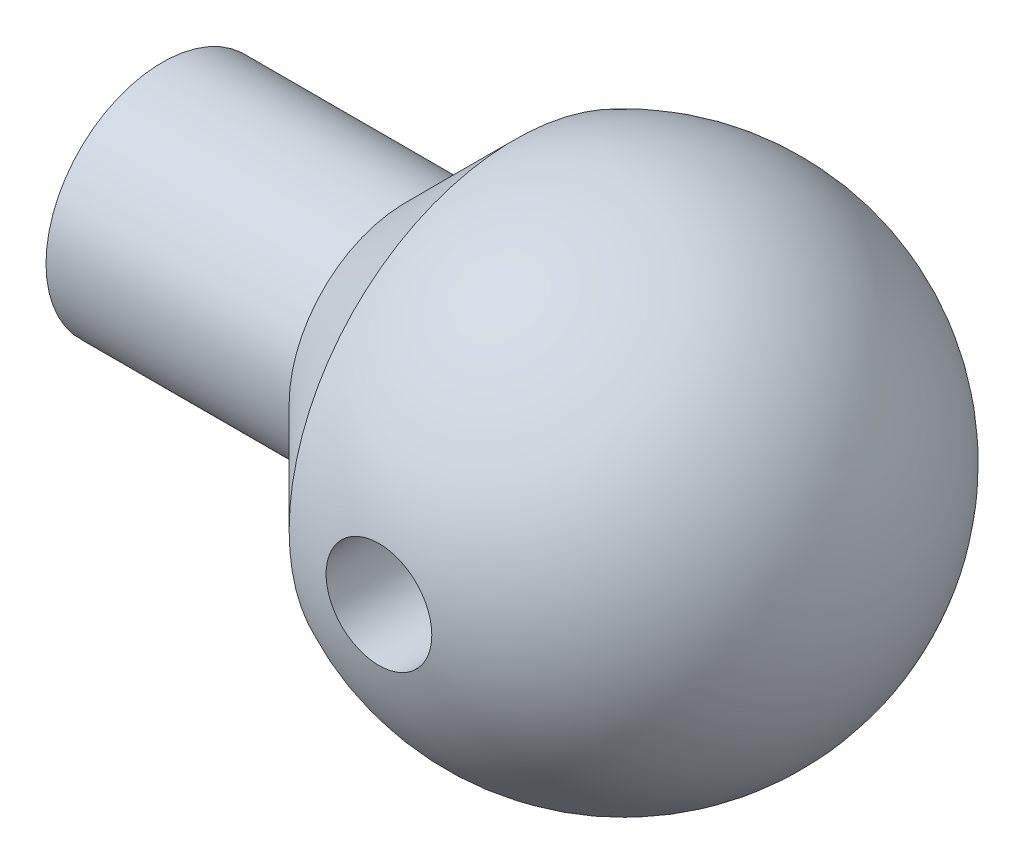
ISO-10303-21;
HEADER;
FILE_DESCRIPTION(('STEP AP214'),'2;1');
FILE_NAME('part.step','',(''),(''),'','','');
FILE_SCHEMA(('AUTOMOTIVE_DESIGN { 1 0 10303 214 1 1 1 1 }'));
ENDSEC;
DATA;
#1=APPLICATION_CONTEXT('core data for automotive mechanical design processes');
#2=APPLICATION_PROTOCOL_DEFINITION('international standard','automotive_design',2000,#1);
#3=PRODUCT_CONTEXT('',#1,'mechanical');
#4=PRODUCT('Part','Part','',(#3));
#5=PRODUCT_RELATED_PRODUCT_CATEGORY('part','',(#4));
#6=PRODUCT_DEFINITION_FORMATION('','',#4);
#7=PRODUCT_DEFINITION_CONTEXT('part definition',#1,'design');
#8=PRODUCT_DEFINITION('design','',#6,#7);
#9=PRODUCT_DEFINITION_SHAPE('','',#8);
#10=(LENGTH_UNIT() NAMED_UNIT(*) SI_UNIT(.MILLI.,.METRE.));
#11=(NAMED_UNIT(*) PLANE_ANGLE_UNIT() SI_UNIT($,.RADIAN.));
#12=(NAMED_UNIT(*) SI_UNIT($,.STERADIAN.) SOLID_ANGLE_UNIT());
#13=UNCERTAINTY_MEASURE_WITH_UNIT(LENGTH_MEASURE(1.E-05),#10,'distance_accuracy_value','');
#14=(GEOMETRIC_REPRESENTATION_CONTEXT(3) GLOBAL_UNCERTAINTY_ASSIGNED_CONTEXT((#13)) GLOBAL_UNIT_ASSIGNED_CONTEXT((#10,
#11,#12)) REPRESENTATION_CONTEXT('',''));
#15=CARTESIAN_POINT('',(0.,0.,0.));
#16=DIRECTION('',(0.,0.,1.));
#17=DIRECTION('',(1.,0.,0.));
#18=AXIS2_PLACEMENT_3D('',#15,#16,#17);
#19=CARTESIAN_POINT('',(0.,0.,0.));
#20=DIRECTION('',(1.,0.,0.));
#21=DIRECTION('',(0.,0.,-1.));
#22=AXIS2_PLACEMENT_3D('',#19,#20,#21);
#23=CONICAL_SURFACE('',#22,0.,1.02974425867666);
#24=CARTESIAN_POINT('',(1.98284004279094,0.,0.));
#25=DIRECTION('',(-1.,0.,0.));
#26=DIRECTION('',(0.,0.,1.));
#27=AXIS2_PLACEMENT_3D('',#24,#25,#26);
#28=CIRCLE('',#27,3.3);
#29=CARTESIAN_POINT('',(1.98284004279094,0.,3.3));
#30=VERTEX_POINT('',#29);
#31=EDGE_CURVE('E11',#30,#30,#28,.T.);
#32=ORIENTED_EDGE('',*,*,#31,.T.);
#33=EDGE_LOOP('',(#32));
#34=FACE_BOUND('',#33,.T.);
#35=CARTESIAN_POINT('',(0.,0.,0.));
#36=VERTEX_POINT('',#35);
#37=VERTEX_LOOP('',#36);
#38=FACE_BOUND('',#37,.T.);
#39=ADVANCED_FACE('F38',(#34,#38),#23,.T.);
#40=CARTESIAN_POINT('',(0.,0.,0.));
#41=DIRECTION('',(-1.,0.,0.));
#42=DIRECTION('',(0.,0.,1.));
#43=AXIS2_PLACEMENT_3D('',#40,#41,#42);
#44=CYLINDRICAL_SURFACE('',#43,3.3);
#45=CARTESIAN_POINT('',(8.88284004279095,0.,0.));
#46=DIRECTION('',(-1.,0.,0.));
#47=DIRECTION('',(0.,0.,1.));
#48=AXIS2_PLACEMENT_3D('',#45,#46,#47);
#49=CIRCLE('',#48,3.3);
#50=CARTESIAN_POINT('',(8.88284004279095,0.,3.3));
#51=VERTEX_POINT('',#50);
#52=EDGE_CURVE('E46',#51,#51,#49,.T.);
#53=ORIENTED_EDGE('',*,*,#52,.T.);
#54=EDGE_LOOP('',(#53));
#55=FACE_BOUND('',#54,.T.);
#56=ORIENTED_EDGE('',*,*,#31,.F.);
#57=EDGE_LOOP('',(#56));
#58=FACE_BOUND('',#57,.T.);
#59=ADVANCED_FACE('F51',(#55,#58),#44,.T.);
#60=CARTESIAN_POINT('',(8.88284004279095,0.,0.));
#61=DIRECTION('',(1.,0.,0.));
#62=DIRECTION('',(0.,0.,-1.));
#63=AXIS2_PLACEMENT_3D('',#60,#61,#62);
#64=CONICAL_SURFACE('',#63,3.3,0.785398163397451);
#65=CARTESIAN_POINT('',(11.9828400427909,0.,0.));
#66=DIRECTION('',(-1.,0.,0.));
#67=DIRECTION('',(0.,0.,1.));
#68=AXIS2_PLACEMENT_3D('',#65,#66,#67);
#69=CIRCLE('',#68,6.4);
#70=CARTESIAN_POINT('',(11.9828400427909,0.,6.4));
#71=VERTEX_POINT('',#70);
#72=EDGE_CURVE('E85',#71,#71,#69,.T.);
#73=ORIENTED_EDGE('',*,*,#72,.T.);
#74=EDGE_LOOP('',(#73));
#75=FACE_BOUND('',#74,.T.);
#76=ORIENTED_EDGE('',*,*,#52,.F.);
#77=EDGE_LOOP('',(#76));
#78=FACE_BOUND('',#77,.T.);
#79=ADVANCED_FACE('F56',(#75,#78),#64,.T.);
#80=CARTESIAN_POINT('',(15.0828400427909,0.,0.));
#81=DIRECTION('',(-1.,0.,0.));
#82=DIRECTION('',(0.,-1.,0.));
#83=AXIS2_PLACEMENT_3D('',#80,#81,#82);
#84=SPHERICAL_SURFACE('',#83,7.11125867902441);
#85=CARTESIAN_POINT('',(15.0828400427909,0.,6.9512588787931));
#86=DIRECTION('',(0.,0.,-1.));
#87=DIRECTION('',(-1.,0.,0.));
#88=AXIS2_PLACEMENT_3D('',#85,#86,#87);
#89=CIRCLE('',#88,1.5);
#90=CARTESIAN_POINT('',(16.5828400427909,0.,6.95125887879311));
#91=VERTEX_POINT('',#90);
#92=EDGE_CURVE('E41',#91,#91,#89,.F.);
#93=ORIENTED_EDGE('',*,*,#92,.F.);
#94=EDGE_LOOP('',(#93));
#95=FACE_BOUND('',#94,.T.);
#96=CARTESIAN_POINT('',(15.0828400427909,0.,-6.95125887879311));
#97=DIRECTION('',(0.,0.,1.));
#98=DIRECTION('',(1.,0.,0.));
#99=AXIS2_PLACEMENT_3D('',#96,#97,#98);
#100=CIRCLE('',#99,1.5);
#101=CARTESIAN_POINT('',(16.5828400427909,0.,-6.95125887879311));
#102=VERTEX_POINT('',#101);
#103=EDGE_CURVE('E81',#102,#102,#100,.F.);
#104=ORIENTED_EDGE('',*,*,#103,.F.);
#105=EDGE_LOOP('',(#104));
#106=FACE_BOUND('',#105,.T.);
#107=ORIENTED_EDGE('',*,*,#72,.F.);
#108=EDGE_LOOP('',(#107));
#109=FACE_BOUND('',#108,.T.);
#110=ADVANCED_FACE('F63',(#95,#106,#109),#84,.T.);
#111=CARTESIAN_POINT('',(15.0828400427909,0.,-7.11125867902441));
#112=DIRECTION('',(0.,0.,1.));
#113=DIRECTION('',(1.,0.,0.));
#114=AXIS2_PLACEMENT_3D('',#111,#112,#113);
#115=CYLINDRICAL_SURFACE('',#114,1.5);
#116=CARTESIAN_POINT('',(16.5828400427909,0.,6.95125887879311));
#117=CARTESIAN_POINT('',(16.5828400427909,0.,6.80644098548492));
#118=CARTESIAN_POINT('',(16.5828400427909,0.,6.66162309217673));
#119=CARTESIAN_POINT('',(16.5828400427909,0.,6.37198730556035));
#120=CARTESIAN_POINT('',(16.5828400427909,0.,6.22716941225216));
#121=CARTESIAN_POINT('',(16.5828400427909,0.,5.93753362563578));
#122=CARTESIAN_POINT('',(16.5828400427909,0.,5.79271573232759));
#123=CARTESIAN_POINT('',(16.5828400427909,0.,5.50307994571121));
#124=CARTESIAN_POINT('',(16.5828400427909,0.,5.35826205240302));
#125=CARTESIAN_POINT('',(16.5828400427909,0.,5.06862626578664));
#126=CARTESIAN_POINT('',(16.5828400427909,0.,4.92380837247845));
#127=CARTESIAN_POINT('',(16.5828400427909,0.,4.63417258586207));
#128=CARTESIAN_POINT('',(16.5828400427909,0.,4.48935469255388));
#129=CARTESIAN_POINT('',(16.5828400427909,0.,4.1997189059375));
#130=CARTESIAN_POINT('',(16.5828400427909,0.,4.05490101262931));
#131=CARTESIAN_POINT('',(16.5828400427909,0.,3.76526522601293));
#132=CARTESIAN_POINT('',(16.5828400427909,0.,3.62044733270474));
#133=CARTESIAN_POINT('',(16.5828400427909,0.,3.33081154608836));
#134=CARTESIAN_POINT('',(16.5828400427909,0.,3.18599365278017));
#135=CARTESIAN_POINT('',(16.5828400427909,0.,2.89635786616379));
#136=CARTESIAN_POINT('',(16.5828400427909,0.,2.7515399728556));
#137=CARTESIAN_POINT('',(16.5828400427909,0.,2.46190418623922));
#138=CARTESIAN_POINT('',(16.5828400427909,0.,2.31708629293103));
#139=CARTESIAN_POINT('',(16.5828400427909,0.,2.02745050631465));
#140=CARTESIAN_POINT('',(16.5828400427909,0.,1.88263261300646));
#141=CARTESIAN_POINT('',(16.5828400427909,0.,1.59299682639009));
#142=CARTESIAN_POINT('',(16.5828400427909,0.,1.4481789330819));
#143=CARTESIAN_POINT('',(16.5828400427909,0.,1.15854314646552));
#144=CARTESIAN_POINT('',(16.5828400427909,0.,1.01372525315733));
#145=CARTESIAN_POINT('',(16.5828400427909,0.,0.724089466540948));
#146=CARTESIAN_POINT('',(16.5828400427909,0.,0.579271573232758));
#147=CARTESIAN_POINT('',(16.5828400427909,0.,0.289635786616379));
#148=CARTESIAN_POINT('',(16.5828400427909,0.,0.144817893308189));
#149=CARTESIAN_POINT('',(16.5828400427909,0.,-0.144817893308191));
#150=CARTESIAN_POINT('',(16.5828400427909,0.,-0.28963578661638));
#151=CARTESIAN_POINT('',(16.5828400427909,0.,-0.57927157323276));
#152=CARTESIAN_POINT('',(16.5828400427909,0.,-0.72408946654095));
#153=CARTESIAN_POINT('',(16.5828400427909,0.,-1.01372525315733));
#154=CARTESIAN_POINT('',(16.5828400427909,0.,-1.15854314646552));
#155=CARTESIAN_POINT('',(16.5828400427909,0.,-1.4481789330819));
#156=CARTESIAN_POINT('',(16.5828400427909,0.,-1.59299682639009));
#157=CARTESIAN_POINT('',(16.5828400427909,0.,-1.88263261300647));
#158=CARTESIAN_POINT('',(16.5828400427909,0.,-2.02745050631466));
#159=CARTESIAN_POINT('',(16.5828400427909,0.,-2.31708629293104));
#160=CARTESIAN_POINT('',(16.5828400427909,0.,-2.46190418623923));
#161=CARTESIAN_POINT('',(16.5828400427909,0.,-2.75153997285561));
#162=CARTESIAN_POINT('',(16.5828400427909,0.,-2.8963578661638));
#163=CARTESIAN_POINT('',(16.5828400427909,0.,-3.18599365278018));
#164=CARTESIAN_POINT('',(16.5828400427909,0.,-3.33081154608836));
#165=CARTESIAN_POINT('',(16.5828400427909,0.,-3.62044733270474));
#166=CARTESIAN_POINT('',(16.5828400427909,0.,-3.76526522601293));
#167=CARTESIAN_POINT('',(16.5828400427909,0.,-4.05490101262931));
#168=CARTESIAN_POINT('',(16.5828400427909,0.,-4.1997189059375));
#169=CARTESIAN_POINT('',(16.5828400427909,0.,-4.48935469255388));
#170=CARTESIAN_POINT('',(16.5828400427909,0.,-4.63417258586207));
#171=CARTESIAN_POINT('',(16.5828400427909,0.,-4.92380837247845));
#172=CARTESIAN_POINT('',(16.5828400427909,0.,-5.06862626578664));
#173=CARTESIAN_POINT('',(16.5828400427909,0.,-5.35826205240302));
#174=CARTESIAN_POINT('',(16.5828400427909,0.,-5.50307994571121));
#175=CARTESIAN_POINT('',(16.5828400427909,0.,-5.79271573232759));
#176=CARTESIAN_POINT('',(16.5828400427909,0.,-5.93753362563578));
#177=CARTESIAN_POINT('',(16.5828400427909,0.,-6.22716941225216));
#178=CARTESIAN_POINT('',(16.5828400427909,0.,-6.37198730556035));
#179=CARTESIAN_POINT('',(16.5828400427909,0.,-6.66162309217673));
#180=CARTESIAN_POINT('',(16.5828400427909,0.,-6.80644098548492));
#181=CARTESIAN_POINT('',(16.5828400427909,0.,-6.95125887879311));
#182=B_SPLINE_CURVE_WITH_KNOTS('',3,(#116,#117,#118,#119,#120,#121,#122,#123,#124,#125,#126,
#127,#128,#129,#130,#131,#132,#133,#134,#135,#136,#137,#138,#139,#140,#141,#142,#143,#144,#145,
#146,#147,#148,#149,#150,#151,#152,#153,#154,#155,#156,#157,#158,#159,#160,#161,#162,#163,#164,
#165,#166,#167,#168,#169,#170,#171,#172,#173,#174,#175,#176,#177,#178,#179,#180,#181),
.UNSPECIFIED.,.F.,.F.,(4,2,2,2,2,2,2,2,2,2,2,2,2,2,2,2,2,2,2,2,2,2,2,2,2,2,2,2,2,2,2,2,4),(0.,
0.434453679924569,0.868907359849139,1.30336103977371,1.73781471969828,2.17226839962285,
2.60672207954742,3.04117575947199,3.47562943939655,3.91008311932112,4.34453679924569,
4.77899047917026,5.21344415909483,5.6478978390194,6.08235151894397,6.51680519886854,
6.95125887879311,7.38571255871768,7.82016623864225,8.25461991856681,8.68907359849138,
9.12352727841595,9.55798095834052,9.99243463826509,10.4268883181897,10.8613419981142,
11.2957956780388,11.7302493579634,12.1647030378879,12.5991567178125,13.0336103977371,
13.4680640776616,13.9025177575862),.UNSPECIFIED.);
#183=EDGE_CURVE('BSEAM70',#91,#102,#182,.T.);
#184=ORIENTED_EDGE('',*,*,#92,.T.);
#185=ORIENTED_EDGE('',*,*,#103,.T.);
#186=ORIENTED_EDGE('',*,*,#183,.T.);
#187=ORIENTED_EDGE('',*,*,#183,.F.);
#188=EDGE_LOOP('',(#184,#186,#185,#187));
#189=FACE_BOUND('',#188,.T.);
#190=ADVANCED_FACE('F70',(#189),#115,.F.);
#191=CLOSED_SHELL('',(#39,#59,#79,#110,#190));
#192=MANIFOLD_SOLID_BREP('B2',#191);
#193=ADVANCED_BREP_SHAPE_REPRESENTATION('',(#18,#192),#14);
#194=SHAPE_DEFINITION_REPRESENTATION(#9,#193);
ENDSEC;
END-ISO-10303-21;
